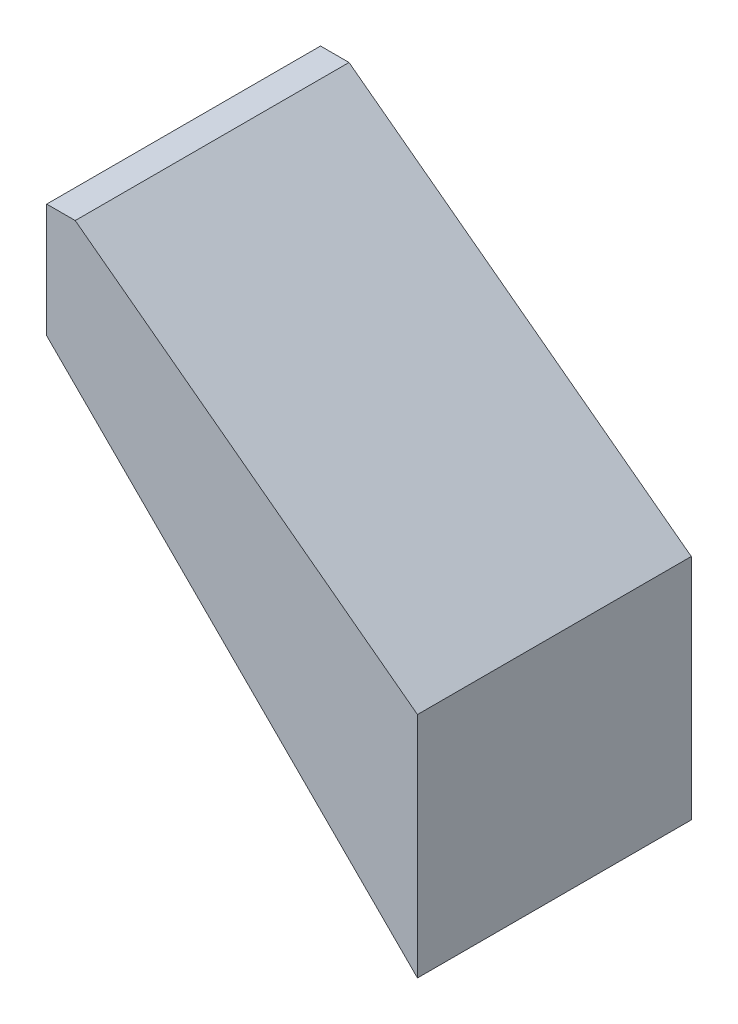
ISO-10303-21;
HEADER;
FILE_DESCRIPTION(('STEP AP214'),'2;1');
FILE_NAME('part.step','',(''),(''),'','','');
FILE_SCHEMA(('AUTOMOTIVE_DESIGN { 1 0 10303 214 1 1 1 1 }'));
ENDSEC;
DATA;
#1=APPLICATION_CONTEXT('core data for automotive mechanical design processes');
#2=APPLICATION_PROTOCOL_DEFINITION('international standard','automotive_design',2000,#1);
#3=PRODUCT_CONTEXT('',#1,'mechanical');
#4=PRODUCT('Part','Part','',(#3));
#5=PRODUCT_RELATED_PRODUCT_CATEGORY('part','',(#4));
#6=PRODUCT_DEFINITION_FORMATION('','',#4);
#7=PRODUCT_DEFINITION_CONTEXT('part definition',#1,'design');
#8=PRODUCT_DEFINITION('design','',#6,#7);
#9=PRODUCT_DEFINITION_SHAPE('','',#8);
#10=(LENGTH_UNIT() NAMED_UNIT(*) SI_UNIT(.MILLI.,.METRE.));
#11=(NAMED_UNIT(*) PLANE_ANGLE_UNIT() SI_UNIT($,.RADIAN.));
#12=(NAMED_UNIT(*) SI_UNIT($,.STERADIAN.) SOLID_ANGLE_UNIT());
#13=UNCERTAINTY_MEASURE_WITH_UNIT(LENGTH_MEASURE(1.E-05),#10,'distance_accuracy_value','');
#14=(GEOMETRIC_REPRESENTATION_CONTEXT(3) GLOBAL_UNCERTAINTY_ASSIGNED_CONTEXT((#13)) GLOBAL_UNIT_ASSIGNED_CONTEXT((#10,
#11,#12)) REPRESENTATION_CONTEXT('',''));
#15=CARTESIAN_POINT('',(0.,0.,0.));
#16=DIRECTION('',(0.,0.,1.));
#17=DIRECTION('',(1.,0.,0.));
#18=AXIS2_PLACEMENT_3D('',#15,#16,#17);
#19=CARTESIAN_POINT('',(-0.4365625,0.6746875,0.));
#20=DIRECTION('',(0.6,0.8,0.));
#21=DIRECTION('',(-0.8,0.6,0.));
#22=AXIS2_PLACEMENT_3D('',#19,#20,#21);
#23=PLANE('',#22);
#24=DIRECTION('',(0.,0.,-1.));
#25=VECTOR('',#24,1.);
#26=CARTESIAN_POINT('',(0.5159375,-0.03968750000001,0.));
#27=LINE('',#26,#25);
#28=CARTESIAN_POINT('',(0.515937500000002,-0.0396875000000068,0.));
#29=VERTEX_POINT('',#28);
#30=CARTESIAN_POINT('',(0.515937500000002,-0.0396875000000068,0.762));
#31=VERTEX_POINT('',#30);
#32=EDGE_CURVE('E70',#29,#31,#27,.F.);
#33=ORIENTED_EDGE('',*,*,#32,.F.);
#34=DIRECTION('',(-0.799999999999996,0.600000000000005,0.));
#35=VECTOR('',#34,1.);
#36=CARTESIAN_POINT('',(0.5159375,-0.03968750000001,0.));
#37=LINE('',#36,#35);
#38=CARTESIAN_POINT('',(-0.4365625,0.6746875,0.));
#39=VERTEX_POINT('',#38);
#40=EDGE_CURVE('E67',#29,#39,#37,.T.);
#41=ORIENTED_EDGE('',*,*,#40,.T.);
#42=DIRECTION('',(0.,0.,1.));
#43=VECTOR('',#42,1.);
#44=CARTESIAN_POINT('',(-0.4365625,0.6746875,0.));
#45=LINE('',#44,#43);
#46=CARTESIAN_POINT('',(-0.4365625,0.6746875,0.762));
#47=VERTEX_POINT('',#46);
#48=EDGE_CURVE('E20',#47,#39,#45,.F.);
#49=ORIENTED_EDGE('',*,*,#48,.F.);
#50=DIRECTION('',(-0.799999999999996,0.600000000000005,0.));
#51=VECTOR('',#50,1.);
#52=CARTESIAN_POINT('',(0.5159375,-0.03968750000001,0.762));
#53=LINE('',#52,#51);
#54=EDGE_CURVE('E62',#31,#47,#53,.T.);
#55=ORIENTED_EDGE('',*,*,#54,.F.);
#56=EDGE_LOOP('',(#33,#41,#49,#55));
#57=FACE_BOUND('',#56,.T.);
#58=ADVANCED_FACE('F17',(#57),#23,.T.);
#59=CARTESIAN_POINT('',(-0.5159375,0.6746875,0.));
#60=DIRECTION('',(0.,1.,0.));
#61=DIRECTION('',(0.,0.,1.));
#62=AXIS2_PLACEMENT_3D('',#59,#60,#61);
#63=PLANE('',#62);
#64=ORIENTED_EDGE('',*,*,#48,.T.);
#65=DIRECTION('',(1.,0.,0.));
#66=VECTOR('',#65,1.);
#67=CARTESIAN_POINT('',(0.5159375,0.6746875,0.));
#68=LINE('',#67,#66);
#69=CARTESIAN_POINT('',(-0.5159375,0.6746875,0.));
#70=VERTEX_POINT('',#69);
#71=EDGE_CURVE('E89',#39,#70,#68,.F.);
#72=ORIENTED_EDGE('',*,*,#71,.T.);
#73=DIRECTION('',(0.,0.,1.));
#74=VECTOR('',#73,1.);
#75=CARTESIAN_POINT('',(-0.5159375,0.6746875,0.));
#76=LINE('',#75,#74);
#77=CARTESIAN_POINT('',(-0.5159375,0.6746875,0.762));
#78=VERTEX_POINT('',#77);
#79=EDGE_CURVE('E74',#78,#70,#76,.F.);
#80=ORIENTED_EDGE('',*,*,#79,.F.);
#81=DIRECTION('',(1.,0.,0.));
#82=VECTOR('',#81,1.);
#83=CARTESIAN_POINT('',(0.5159375,0.6746875,0.762));
#84=LINE('',#83,#82);
#85=EDGE_CURVE('E72',#47,#78,#84,.F.);
#86=ORIENTED_EDGE('',*,*,#85,.F.);
#87=EDGE_LOOP('',(#64,#72,#80,#86));
#88=FACE_BOUND('',#87,.T.);
#89=ADVANCED_FACE('F73',(#88),#63,.T.);
#90=CARTESIAN_POINT('',(0.5159375,-0.03968750000001,0.));
#91=DIRECTION('',(1.,0.,0.));
#92=DIRECTION('',(0.,0.,-1.));
#93=AXIS2_PLACEMENT_3D('',#90,#91,#92);
#94=PLANE('',#93);
#95=DIRECTION('',(0.,0.,1.));
#96=VECTOR('',#95,1.);
#97=CARTESIAN_POINT('',(0.5159375,-0.6746875,0.));
#98=LINE('',#97,#96);
#99=CARTESIAN_POINT('',(0.5159375,-0.6746875,0.));
#100=VERTEX_POINT('',#99);
#101=CARTESIAN_POINT('',(0.5159375,-0.6746875,0.762));
#102=VERTEX_POINT('',#101);
#103=EDGE_CURVE('E95',#100,#102,#98,.T.);
#104=ORIENTED_EDGE('',*,*,#103,.F.);
#105=DIRECTION('',(0.,1.,0.));
#106=VECTOR('',#105,1.);
#107=CARTESIAN_POINT('',(0.5159375,-0.03968750000001,0.));
#108=LINE('',#107,#106);
#109=EDGE_CURVE('E92',#100,#29,#108,.T.);
#110=ORIENTED_EDGE('',*,*,#109,.T.);
#111=ORIENTED_EDGE('',*,*,#32,.T.);
#112=DIRECTION('',(0.,1.,0.));
#113=VECTOR('',#112,1.);
#114=CARTESIAN_POINT('',(0.5159375,-0.03968750000001,0.762));
#115=LINE('',#114,#113);
#116=EDGE_CURVE('E77',#102,#31,#115,.T.);
#117=ORIENTED_EDGE('',*,*,#116,.F.);
#118=EDGE_LOOP('',(#104,#110,#111,#117));
#119=FACE_BOUND('',#118,.T.);
#120=ADVANCED_FACE('F107',(#119),#94,.T.);
#121=CARTESIAN_POINT('',(0.5159375,-0.03968750000001,0.762));
#122=DIRECTION('',(0.,0.,1.));
#123=DIRECTION('',(1.,0.,0.));
#124=AXIS2_PLACEMENT_3D('',#121,#122,#123);
#125=PLANE('',#124);
#126=DIRECTION('',(0.707106781186548,-0.707106781186548,0.));
#127=VECTOR('',#126,1.);
#128=CARTESIAN_POINT('',(0.5159375,-0.6746875,0.762));
#129=LINE('',#128,#127);
#130=CARTESIAN_POINT('',(-0.5159375,0.3571875,0.762));
#131=VERTEX_POINT('',#130);
#132=EDGE_CURVE('E98',#102,#131,#129,.F.);
#133=ORIENTED_EDGE('',*,*,#132,.F.);
#134=ORIENTED_EDGE('',*,*,#116,.T.);
#135=ORIENTED_EDGE('',*,*,#54,.T.);
#136=ORIENTED_EDGE('',*,*,#85,.T.);
#137=DIRECTION('',(0.,1.,0.));
#138=VECTOR('',#137,1.);
#139=CARTESIAN_POINT('',(-0.5159375,0.3571875,0.762));
#140=LINE('',#139,#138);
#141=EDGE_CURVE('E85',#131,#78,#140,.T.);
#142=ORIENTED_EDGE('',*,*,#141,.F.);
#143=EDGE_LOOP('',(#133,#134,#135,#136,#142));
#144=FACE_BOUND('',#143,.T.);
#145=ADVANCED_FACE('F81',(#144),#125,.T.);
#146=CARTESIAN_POINT('',(-0.5159375,0.3571875,0.));
#147=DIRECTION('',(-1.,0.,0.));
#148=DIRECTION('',(0.,0.,1.));
#149=AXIS2_PLACEMENT_3D('',#146,#147,#148);
#150=PLANE('',#149);
#151=ORIENTED_EDGE('',*,*,#79,.T.);
#152=DIRECTION('',(0.,1.,0.));
#153=VECTOR('',#152,1.);
#154=CARTESIAN_POINT('',(-0.5159375,-0.03968750000001,0.));
#155=LINE('',#154,#153);
#156=CARTESIAN_POINT('',(-0.5159375,0.3571875,0.));
#157=VERTEX_POINT('',#156);
#158=EDGE_CURVE('E35',#70,#157,#155,.F.);
#159=ORIENTED_EDGE('',*,*,#158,.T.);
#160=DIRECTION('',(0.,0.,1.));
#161=VECTOR('',#160,1.);
#162=CARTESIAN_POINT('',(-0.5159375,0.3571875,0.));
#163=LINE('',#162,#161);
#164=EDGE_CURVE('E26',#131,#157,#163,.F.);
#165=ORIENTED_EDGE('',*,*,#164,.F.);
#166=ORIENTED_EDGE('',*,*,#141,.T.);
#167=EDGE_LOOP('',(#151,#159,#165,#166));
#168=FACE_BOUND('',#167,.T.);
#169=ADVANCED_FACE('F104',(#168),#150,.T.);
#170=CARTESIAN_POINT('',(0.5159375,-0.03968750000001,0.));
#171=DIRECTION('',(0.,0.,1.));
#172=DIRECTION('',(1.,0.,0.));
#173=AXIS2_PLACEMENT_3D('',#170,#171,#172);
#174=PLANE('',#173);
#175=DIRECTION('',(0.707106781186548,-0.707106781186548,0.));
#176=VECTOR('',#175,1.);
#177=CARTESIAN_POINT('',(0.5159375,-0.6746875,0.));
#178=LINE('',#177,#176);
#179=EDGE_CURVE('E11',#157,#100,#178,.T.);
#180=ORIENTED_EDGE('',*,*,#179,.F.);
#181=ORIENTED_EDGE('',*,*,#158,.F.);
#182=ORIENTED_EDGE('',*,*,#71,.F.);
#183=ORIENTED_EDGE('',*,*,#40,.F.);
#184=ORIENTED_EDGE('',*,*,#109,.F.);
#185=EDGE_LOOP('',(#180,#181,#182,#183,#184));
#186=FACE_BOUND('',#185,.T.);
#187=ADVANCED_FACE('F109',(#186),#174,.F.);
#188=CARTESIAN_POINT('',(0.5159375,-0.6746875,0.));
#189=DIRECTION('',(-0.707106781186548,-0.707106781186548,0.));
#190=DIRECTION('',(0.707106781186548,-0.707106781186548,0.));
#191=AXIS2_PLACEMENT_3D('',#188,#189,#190);
#192=PLANE('',#191);
#193=ORIENTED_EDGE('',*,*,#164,.T.);
#194=ORIENTED_EDGE('',*,*,#179,.T.);
#195=ORIENTED_EDGE('',*,*,#103,.T.);
#196=ORIENTED_EDGE('',*,*,#132,.T.);
#197=EDGE_LOOP('',(#193,#194,#195,#196));
#198=FACE_BOUND('',#197,.T.);
#199=ADVANCED_FACE('F103',(#198),#192,.T.);
#200=CLOSED_SHELL('',(#58,#89,#120,#145,#169,#187,#199));
#201=MANIFOLD_SOLID_BREP('B1',#200);
#202=ADVANCED_BREP_SHAPE_REPRESENTATION('',(#18,#201),#14);
#203=SHAPE_DEFINITION_REPRESENTATION(#9,#202);
ENDSEC;
END-ISO-10303-21;
